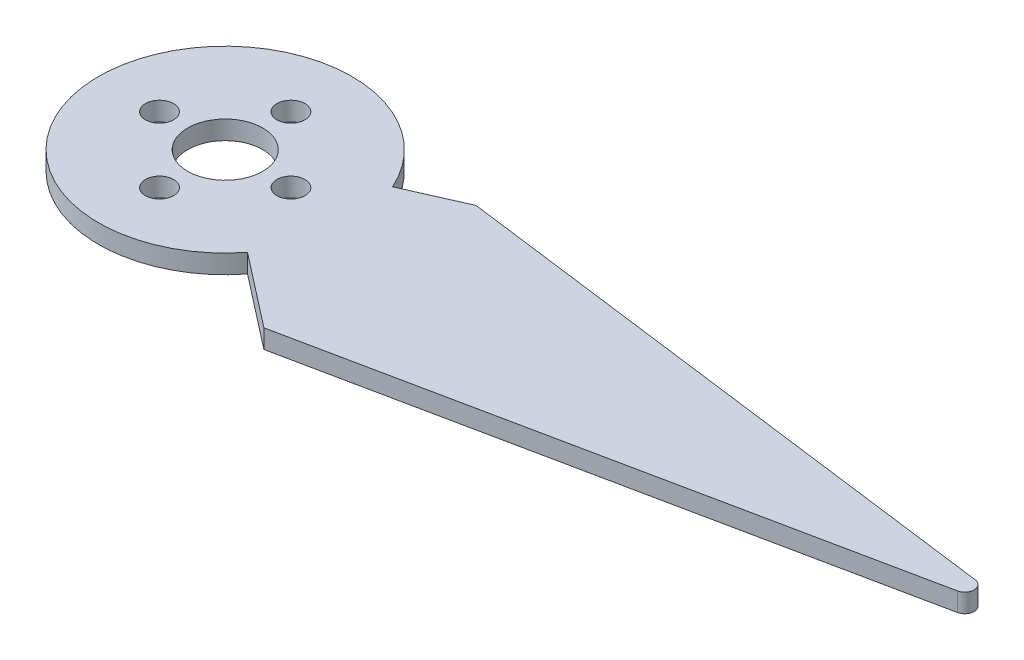
ISO-10303-21;
HEADER;
FILE_DESCRIPTION(('STEP AP214'),'2;1');
FILE_NAME('part.step','',(''),(''),'','','');
FILE_SCHEMA(('AUTOMOTIVE_DESIGN { 1 0 10303 214 1 1 1 1 }'));
ENDSEC;
DATA;
#1=APPLICATION_CONTEXT('core data for automotive mechanical design processes');
#2=APPLICATION_PROTOCOL_DEFINITION('international standard','automotive_design',2000,#1);
#3=PRODUCT_CONTEXT('',#1,'mechanical');
#4=PRODUCT('Part','Part','',(#3));
#5=PRODUCT_RELATED_PRODUCT_CATEGORY('part','',(#4));
#6=PRODUCT_DEFINITION_FORMATION('','',#4);
#7=PRODUCT_DEFINITION_CONTEXT('part definition',#1,'design');
#8=PRODUCT_DEFINITION('design','',#6,#7);
#9=PRODUCT_DEFINITION_SHAPE('','',#8);
#10=(LENGTH_UNIT() NAMED_UNIT(*) SI_UNIT(.MILLI.,.METRE.));
#11=(NAMED_UNIT(*) PLANE_ANGLE_UNIT() SI_UNIT($,.RADIAN.));
#12=(NAMED_UNIT(*) SI_UNIT($,.STERADIAN.) SOLID_ANGLE_UNIT());
#13=UNCERTAINTY_MEASURE_WITH_UNIT(LENGTH_MEASURE(1.E-05),#10,'distance_accuracy_value','');
#14=(GEOMETRIC_REPRESENTATION_CONTEXT(3) GLOBAL_UNCERTAINTY_ASSIGNED_CONTEXT((#13)) GLOBAL_UNIT_ASSIGNED_CONTEXT((#10,
#11,#12)) REPRESENTATION_CONTEXT('',''));
#15=CARTESIAN_POINT('',(0.,0.,0.));
#16=DIRECTION('',(0.,0.,1.));
#17=DIRECTION('',(1.,0.,0.));
#18=AXIS2_PLACEMENT_3D('',#15,#16,#17);
#19=CARTESIAN_POINT('',(0.,-2.,0.));
#20=DIRECTION('',(0.,1.,0.));
#21=DIRECTION('',(0.,0.,1.));
#22=AXIS2_PLACEMENT_3D('',#19,#20,#21);
#23=CYLINDRICAL_SURFACE('',#22,13.5002487061836);
#24=CARTESIAN_POINT('',(0.,0.,0.));
#25=DIRECTION('',(0.,1.,0.));
#26=DIRECTION('',(0.,0.,-1.));
#27=AXIS2_PLACEMENT_3D('',#24,#25,#26);
#28=CIRCLE('',#27,13.5002487061836);
#29=CARTESIAN_POINT('',(12.3377163256135,0.,-5.48064512603233));
#30=VERTEX_POINT('',#29);
#31=CARTESIAN_POINT('',(10.6592491181285,0.,8.28475246259592));
#32=VERTEX_POINT('',#31);
#33=EDGE_CURVE('E119',#30,#32,#28,.T.);
#34=ORIENTED_EDGE('',*,*,#33,.F.);
#35=DIRECTION('',(0.,1.,0.));
#36=VECTOR('',#35,1.);
#37=CARTESIAN_POINT('',(12.3377163256135,-2.,-5.48064512603233));
#38=LINE('',#37,#36);
#39=CARTESIAN_POINT('',(12.3377163256135,-2.,-5.48064512603233));
#40=VERTEX_POINT('',#39);
#41=EDGE_CURVE('E11',#40,#30,#38,.T.);
#42=ORIENTED_EDGE('',*,*,#41,.F.);
#43=CARTESIAN_POINT('',(0.,-2.,0.));
#44=DIRECTION('',(0.,1.,0.));
#45=DIRECTION('',(0.,0.,-1.));
#46=AXIS2_PLACEMENT_3D('',#43,#44,#45);
#47=CIRCLE('',#46,13.5002487061836);
#48=CARTESIAN_POINT('',(10.6592491181285,-2.,8.28475246259592));
#49=VERTEX_POINT('',#48);
#50=EDGE_CURVE('E134',#40,#49,#47,.T.);
#51=ORIENTED_EDGE('',*,*,#50,.T.);
#52=DIRECTION('',(0.,1.,0.));
#53=VECTOR('',#52,1.);
#54=CARTESIAN_POINT('',(10.6592491181285,-2.,8.28475246259592));
#55=LINE('',#54,#53);
#56=EDGE_CURVE('E37',#49,#32,#55,.T.);
#57=ORIENTED_EDGE('',*,*,#56,.T.);
#58=EDGE_LOOP('',(#34,#42,#51,#57));
#59=FACE_BOUND('',#58,.T.);
#60=ADVANCED_FACE('F34',(#59),#23,.T.);
#61=CARTESIAN_POINT('',(18.5,-2.,-8.21572495840736));
#62=DIRECTION('',(-0.405678539472798,0.,-0.914015821860441));
#63=DIRECTION('',(-0.914015821860441,0.,0.405678539472798));
#64=AXIS2_PLACEMENT_3D('',#61,#62,#63);
#65=PLANE('',#64);
#66=DIRECTION('',(-0.914015821860441,0.,0.405678539472798));
#67=VECTOR('',#66,1.);
#68=CARTESIAN_POINT('',(18.5,0.,-8.21572495840736));
#69=LINE('',#68,#67);
#70=CARTESIAN_POINT('',(18.5,0.,-8.21572495840736));
#71=VERTEX_POINT('',#70);
#72=EDGE_CURVE('E132',#71,#30,#69,.T.);
#73=ORIENTED_EDGE('',*,*,#72,.F.);
#74=DIRECTION('',(0.,1.,0.));
#75=VECTOR('',#74,1.);
#76=CARTESIAN_POINT('',(18.5,-2.,-8.21572495840736));
#77=LINE('',#76,#75);
#78=CARTESIAN_POINT('',(18.5,-2.,-8.21572495840736));
#79=VERTEX_POINT('',#78);
#80=EDGE_CURVE('E43',#79,#71,#77,.T.);
#81=ORIENTED_EDGE('',*,*,#80,.F.);
#82=DIRECTION('',(-0.914015821860441,0.,0.405678539472798));
#83=VECTOR('',#82,1.);
#84=CARTESIAN_POINT('',(18.5,-2.,-8.21572495840736));
#85=LINE('',#84,#83);
#86=EDGE_CURVE('E109',#79,#40,#85,.T.);
#87=ORIENTED_EDGE('',*,*,#86,.T.);
#88=ORIENTED_EDGE('',*,*,#41,.T.);
#89=EDGE_LOOP('',(#73,#81,#87,#88));
#90=FACE_BOUND('',#89,.T.);
#91=ADVANCED_FACE('F142',(#90),#65,.T.);
#92=CARTESIAN_POINT('',(79.636333374832,-2.,-0.26615071702802));
#93=DIRECTION('',(0.128944753513618,0.,-0.991651778872661));
#94=DIRECTION('',(-0.991651778872661,0.,-0.128944753513618));
#95=AXIS2_PLACEMENT_3D('',#92,#93,#94);
#96=PLANE('',#95);
#97=DIRECTION('',(-0.991651778872661,0.,-0.128944753513618));
#98=VECTOR('',#97,1.);
#99=CARTESIAN_POINT('',(79.636333374832,0.,-0.26615071702802));
#100=LINE('',#99,#98);
#101=CARTESIAN_POINT('',(79.636333374832,0.,-0.26615071702802));
#102=VERTEX_POINT('',#101);
#103=EDGE_CURVE('E96',#102,#71,#100,.T.);
#104=ORIENTED_EDGE('',*,*,#103,.F.);
#105=DIRECTION('',(0.,1.,0.));
#106=VECTOR('',#105,1.);
#107=CARTESIAN_POINT('',(79.636333374832,-2.,-0.26615071702802));
#108=LINE('',#107,#106);
#109=CARTESIAN_POINT('',(79.636333374832,-2.,-0.26615071702802));
#110=VERTEX_POINT('',#109);
#111=EDGE_CURVE('E91',#110,#102,#108,.T.);
#112=ORIENTED_EDGE('',*,*,#111,.F.);
#113=DIRECTION('',(-0.991651778872661,0.,-0.128944753513618));
#114=VECTOR('',#113,1.);
#115=CARTESIAN_POINT('',(79.636333374832,-2.,-0.26615071702802));
#116=LINE('',#115,#114);
#117=EDGE_CURVE('E94',#110,#79,#116,.T.);
#118=ORIENTED_EDGE('',*,*,#117,.T.);
#119=ORIENTED_EDGE('',*,*,#80,.T.);
#120=EDGE_LOOP('',(#104,#112,#118,#119));
#121=FACE_BOUND('',#120,.T.);
#122=ADVANCED_FACE('F93',(#121),#96,.T.);
#123=CARTESIAN_POINT('',(79.5073886213185,-2.,0.725501061844657));
#124=DIRECTION('',(0.,1.,0.));
#125=DIRECTION('',(0.,0.,1.));
#126=AXIS2_PLACEMENT_3D('',#123,#124,#125);
#127=CYLINDRICAL_SURFACE('',#126,1.);
#128=CARTESIAN_POINT('',(79.5073886213185,0.,0.725501061844657));
#129=DIRECTION('',(0.,1.,0.));
#130=DIRECTION('',(0.,0.,1.));
#131=AXIS2_PLACEMENT_3D('',#128,#129,#130);
#132=CIRCLE('',#131,1.);
#133=CARTESIAN_POINT('',(79.7101471484345,0.,1.70472982964192));
#134=VERTEX_POINT('',#133);
#135=EDGE_CURVE('E129',#134,#102,#132,.T.);
#136=ORIENTED_EDGE('',*,*,#135,.F.);
#137=DIRECTION('',(0.,1.,0.));
#138=VECTOR('',#137,1.);
#139=CARTESIAN_POINT('',(79.7101471484345,-2.,1.70472982964192));
#140=LINE('',#139,#138);
#141=CARTESIAN_POINT('',(79.7101471484345,-2.,1.70472982964192));
#142=VERTEX_POINT('',#141);
#143=EDGE_CURVE('E101',#142,#134,#140,.T.);
#144=ORIENTED_EDGE('',*,*,#143,.F.);
#145=CARTESIAN_POINT('',(79.5073886213185,-2.,0.725501061844657));
#146=DIRECTION('',(0.,1.,0.));
#147=DIRECTION('',(0.,0.,1.));
#148=AXIS2_PLACEMENT_3D('',#145,#146,#147);
#149=CIRCLE('',#148,1.);
#150=EDGE_CURVE('E107',#142,#110,#149,.T.);
#151=ORIENTED_EDGE('',*,*,#150,.T.);
#152=ORIENTED_EDGE('',*,*,#111,.T.);
#153=EDGE_LOOP('',(#136,#144,#151,#152));
#154=FACE_BOUND('',#153,.T.);
#155=ADVANCED_FACE('F111',(#154),#127,.T.);
#156=CARTESIAN_POINT('',(18.5,-2.,14.3788665467399));
#157=DIRECTION('',(0.202758527116121,0.,0.97922876779724));
#158=DIRECTION('',(0.97922876779724,0.,-0.202758527116121));
#159=AXIS2_PLACEMENT_3D('',#156,#157,#158);
#160=PLANE('',#159);
#161=DIRECTION('',(0.97922876779724,0.,-0.202758527116121));
#162=VECTOR('',#161,1.);
#163=CARTESIAN_POINT('',(18.5,0.,14.3788665467399));
#164=LINE('',#163,#162);
#165=CARTESIAN_POINT('',(18.5,0.,14.3788665467399));
#166=VERTEX_POINT('',#165);
#167=EDGE_CURVE('E126',#166,#134,#164,.T.);
#168=ORIENTED_EDGE('',*,*,#167,.F.);
#169=DIRECTION('',(0.,1.,0.));
#170=VECTOR('',#169,1.);
#171=CARTESIAN_POINT('',(18.5,-2.,14.3788665467399));
#172=LINE('',#171,#170);
#173=CARTESIAN_POINT('',(18.5,-2.,14.3788665467399));
#174=VERTEX_POINT('',#173);
#175=EDGE_CURVE('E137',#174,#166,#172,.T.);
#176=ORIENTED_EDGE('',*,*,#175,.F.);
#177=DIRECTION('',(0.97922876779724,0.,-0.202758527116121));
#178=VECTOR('',#177,1.);
#179=CARTESIAN_POINT('',(18.5,-2.,14.3788665467399));
#180=LINE('',#179,#178);
#181=EDGE_CURVE('E112',#174,#142,#180,.T.);
#182=ORIENTED_EDGE('',*,*,#181,.T.);
#183=ORIENTED_EDGE('',*,*,#143,.T.);
#184=EDGE_LOOP('',(#168,#176,#182,#183));
#185=FACE_BOUND('',#184,.T.);
#186=ADVANCED_FACE('F155',(#185),#160,.T.);
#187=CARTESIAN_POINT('',(10.6592491181285,-2.,8.28475246259592));
#188=DIRECTION('',(-0.613674062078665,0.,0.78955946294872));
#189=DIRECTION('',(0.78955946294872,0.,0.613674062078665));
#190=AXIS2_PLACEMENT_3D('',#187,#188,#189);
#191=PLANE('',#190);
#192=DIRECTION('',(0.78955946294872,0.,0.613674062078664));
#193=VECTOR('',#192,1.);
#194=CARTESIAN_POINT('',(10.6592491181285,0.,8.28475246259592));
#195=LINE('',#194,#193);
#196=EDGE_CURVE('E122',#32,#166,#195,.T.);
#197=ORIENTED_EDGE('',*,*,#196,.F.);
#198=ORIENTED_EDGE('',*,*,#56,.F.);
#199=DIRECTION('',(0.78955946294872,0.,0.613674062078664));
#200=VECTOR('',#199,1.);
#201=CARTESIAN_POINT('',(10.6592491181285,-2.,8.28475246259592));
#202=LINE('',#201,#200);
#203=EDGE_CURVE('E114',#49,#174,#202,.T.);
#204=ORIENTED_EDGE('',*,*,#203,.T.);
#205=ORIENTED_EDGE('',*,*,#175,.T.);
#206=EDGE_LOOP('',(#197,#198,#204,#205));
#207=FACE_BOUND('',#206,.T.);
#208=ADVANCED_FACE('F139',(#207),#191,.T.);
#209=CARTESIAN_POINT('',(0.,-2.,0.));
#210=DIRECTION('',(0.,-1.,0.));
#211=DIRECTION('',(0.,0.,-1.));
#212=AXIS2_PLACEMENT_3D('',#209,#210,#211);
#213=PLANE('',#212);
#214=CARTESIAN_POINT('',(7.,-2.,0.));
#215=DIRECTION('',(0.,1.,0.));
#216=DIRECTION('',(-1.,0.,0.));
#217=AXIS2_PLACEMENT_3D('',#214,#215,#216);
#218=CIRCLE('',#217,1.5);
#219=CARTESIAN_POINT('',(5.5,-2.,0.));
#220=VERTEX_POINT('',#219);
#221=EDGE_CURVE('E193',#220,#220,#218,.T.);
#222=ORIENTED_EDGE('',*,*,#221,.T.);
#223=EDGE_LOOP('',(#222));
#224=FACE_BOUND('',#223,.T.);
#225=CARTESIAN_POINT('',(0.,-2.,7.));
#226=DIRECTION('',(0.,1.,0.));
#227=DIRECTION('',(0.,0.,-1.));
#228=AXIS2_PLACEMENT_3D('',#225,#226,#227);
#229=CIRCLE('',#228,1.5);
#230=CARTESIAN_POINT('',(0.,-2.,5.5));
#231=VERTEX_POINT('',#230);
#232=EDGE_CURVE('E201',#231,#231,#229,.T.);
#233=ORIENTED_EDGE('',*,*,#232,.T.);
#234=EDGE_LOOP('',(#233));
#235=FACE_BOUND('',#234,.T.);
#236=CARTESIAN_POINT('',(-7.,-2.,0.));
#237=DIRECTION('',(0.,1.,0.));
#238=DIRECTION('',(1.,0.,0.));
#239=AXIS2_PLACEMENT_3D('',#236,#237,#238);
#240=CIRCLE('',#239,1.5);
#241=CARTESIAN_POINT('',(-5.5,-2.,0.));
#242=VERTEX_POINT('',#241);
#243=EDGE_CURVE('E207',#242,#242,#240,.T.);
#244=ORIENTED_EDGE('',*,*,#243,.T.);
#245=EDGE_LOOP('',(#244));
#246=FACE_BOUND('',#245,.T.);
#247=CARTESIAN_POINT('',(0.,-2.,-7.));
#248=DIRECTION('',(0.,1.,0.));
#249=DIRECTION('',(0.,0.,1.));
#250=AXIS2_PLACEMENT_3D('',#247,#248,#249);
#251=CIRCLE('',#250,1.5);
#252=CARTESIAN_POINT('',(0.,-2.,-5.5));
#253=VERTEX_POINT('',#252);
#254=EDGE_CURVE('E213',#253,#253,#251,.T.);
#255=ORIENTED_EDGE('',*,*,#254,.T.);
#256=EDGE_LOOP('',(#255));
#257=FACE_BOUND('',#256,.T.);
#258=CARTESIAN_POINT('',(0.,-2.,0.));
#259=DIRECTION('',(0.,1.,0.));
#260=DIRECTION('',(0.,0.,1.));
#261=AXIS2_PLACEMENT_3D('',#258,#259,#260);
#262=CIRCLE('',#261,4.);
#263=CARTESIAN_POINT('',(0.,-2.,4.));
#264=VERTEX_POINT('',#263);
#265=EDGE_CURVE('E123',#264,#264,#262,.T.);
#266=ORIENTED_EDGE('',*,*,#265,.T.);
#267=EDGE_LOOP('',(#266));
#268=FACE_BOUND('',#267,.T.);
#269=ORIENTED_EDGE('',*,*,#50,.F.);
#270=ORIENTED_EDGE('',*,*,#86,.F.);
#271=ORIENTED_EDGE('',*,*,#117,.F.);
#272=ORIENTED_EDGE('',*,*,#150,.F.);
#273=ORIENTED_EDGE('',*,*,#181,.F.);
#274=ORIENTED_EDGE('',*,*,#203,.F.);
#275=EDGE_LOOP('',(#269,#270,#271,#272,#273,#274));
#276=FACE_BOUND('',#275,.T.);
#277=ADVANCED_FACE('F105',(#224,#235,#246,#257,#268,#276),#213,.T.);
#278=CARTESIAN_POINT('',(0.,0.,0.));
#279=DIRECTION('',(0.,-1.,0.));
#280=DIRECTION('',(0.,0.,-1.));
#281=AXIS2_PLACEMENT_3D('',#278,#279,#280);
#282=PLANE('',#281);
#283=CARTESIAN_POINT('',(7.,0.,0.));
#284=DIRECTION('',(0.,1.,0.));
#285=DIRECTION('',(-1.,0.,0.));
#286=AXIS2_PLACEMENT_3D('',#283,#284,#285);
#287=CIRCLE('',#286,1.5);
#288=CARTESIAN_POINT('',(5.5,0.,0.));
#289=VERTEX_POINT('',#288);
#290=EDGE_CURVE('E196',#289,#289,#287,.T.);
#291=ORIENTED_EDGE('',*,*,#290,.F.);
#292=EDGE_LOOP('',(#291));
#293=FACE_BOUND('',#292,.T.);
#294=CARTESIAN_POINT('',(0.,0.,7.));
#295=DIRECTION('',(0.,1.,0.));
#296=DIRECTION('',(0.,0.,-1.));
#297=AXIS2_PLACEMENT_3D('',#294,#295,#296);
#298=CIRCLE('',#297,1.5);
#299=CARTESIAN_POINT('',(0.,0.,5.5));
#300=VERTEX_POINT('',#299);
#301=EDGE_CURVE('E198',#300,#300,#298,.T.);
#302=ORIENTED_EDGE('',*,*,#301,.F.);
#303=EDGE_LOOP('',(#302));
#304=FACE_BOUND('',#303,.T.);
#305=CARTESIAN_POINT('',(-7.,0.,0.));
#306=DIRECTION('',(0.,1.,0.));
#307=DIRECTION('',(1.,0.,0.));
#308=AXIS2_PLACEMENT_3D('',#305,#306,#307);
#309=CIRCLE('',#308,1.5);
#310=CARTESIAN_POINT('',(-5.5,0.,0.));
#311=VERTEX_POINT('',#310);
#312=EDGE_CURVE('E204',#311,#311,#309,.T.);
#313=ORIENTED_EDGE('',*,*,#312,.F.);
#314=EDGE_LOOP('',(#313));
#315=FACE_BOUND('',#314,.T.);
#316=CARTESIAN_POINT('',(0.,0.,-7.));
#317=DIRECTION('',(0.,1.,0.));
#318=DIRECTION('',(0.,0.,1.));
#319=AXIS2_PLACEMENT_3D('',#316,#317,#318);
#320=CIRCLE('',#319,1.5);
#321=CARTESIAN_POINT('',(0.,0.,-5.5));
#322=VERTEX_POINT('',#321);
#323=EDGE_CURVE('E210',#322,#322,#320,.T.);
#324=ORIENTED_EDGE('',*,*,#323,.F.);
#325=EDGE_LOOP('',(#324));
#326=FACE_BOUND('',#325,.T.);
#327=CARTESIAN_POINT('',(0.,0.,0.));
#328=DIRECTION('',(0.,1.,0.));
#329=DIRECTION('',(0.,0.,1.));
#330=AXIS2_PLACEMENT_3D('',#327,#328,#329);
#331=CIRCLE('',#330,4.);
#332=CARTESIAN_POINT('',(0.,0.,4.));
#333=VERTEX_POINT('',#332);
#334=EDGE_CURVE('E216',#333,#333,#331,.T.);
#335=ORIENTED_EDGE('',*,*,#334,.F.);
#336=EDGE_LOOP('',(#335));
#337=FACE_BOUND('',#336,.T.);
#338=ORIENTED_EDGE('',*,*,#33,.T.);
#339=ORIENTED_EDGE('',*,*,#196,.T.);
#340=ORIENTED_EDGE('',*,*,#167,.T.);
#341=ORIENTED_EDGE('',*,*,#135,.T.);
#342=ORIENTED_EDGE('',*,*,#103,.T.);
#343=ORIENTED_EDGE('',*,*,#72,.T.);
#344=EDGE_LOOP('',(#338,#339,#340,#341,#342,#343));
#345=FACE_BOUND('',#344,.T.);
#346=ADVANCED_FACE('F141',(#293,#304,#315,#326,#337,#345),#282,.F.);
#347=CARTESIAN_POINT('',(0.,-2.,0.));
#348=DIRECTION('',(0.,1.,0.));
#349=DIRECTION('',(0.,0.,1.));
#350=AXIS2_PLACEMENT_3D('',#347,#348,#349);
#351=CYLINDRICAL_SURFACE('',#350,4.);
#352=ORIENTED_EDGE('',*,*,#265,.F.);
#353=EDGE_LOOP('',(#352));
#354=FACE_BOUND('',#353,.T.);
#355=ORIENTED_EDGE('',*,*,#334,.T.);
#356=EDGE_LOOP('',(#355));
#357=FACE_BOUND('',#356,.T.);
#358=ADVANCED_FACE('F166',(#354,#357),#351,.F.);
#359=CARTESIAN_POINT('',(0.,-2.,-7.));
#360=DIRECTION('',(0.,1.,0.));
#361=DIRECTION('',(0.,0.,1.));
#362=AXIS2_PLACEMENT_3D('',#359,#360,#361);
#363=CYLINDRICAL_SURFACE('',#362,1.5);
#364=ORIENTED_EDGE('',*,*,#254,.F.);
#365=EDGE_LOOP('',(#364));
#366=FACE_BOUND('',#365,.T.);
#367=ORIENTED_EDGE('',*,*,#323,.T.);
#368=EDGE_LOOP('',(#367));
#369=FACE_BOUND('',#368,.T.);
#370=ADVANCED_FACE('F173',(#366,#369),#363,.F.);
#371=CARTESIAN_POINT('',(-7.,-2.,0.));
#372=DIRECTION('',(0.,1.,0.));
#373=DIRECTION('',(0.,0.,1.));
#374=AXIS2_PLACEMENT_3D('',#371,#372,#373);
#375=CYLINDRICAL_SURFACE('',#374,1.5);
#376=ORIENTED_EDGE('',*,*,#243,.F.);
#377=EDGE_LOOP('',(#376));
#378=FACE_BOUND('',#377,.T.);
#379=ORIENTED_EDGE('',*,*,#312,.T.);
#380=EDGE_LOOP('',(#379));
#381=FACE_BOUND('',#380,.T.);
#382=ADVANCED_FACE('F177',(#378,#381),#375,.F.);
#383=CARTESIAN_POINT('',(0.,-2.,7.));
#384=DIRECTION('',(0.,1.,0.));
#385=DIRECTION('',(0.,0.,1.));
#386=AXIS2_PLACEMENT_3D('',#383,#384,#385);
#387=CYLINDRICAL_SURFACE('',#386,1.5);
#388=ORIENTED_EDGE('',*,*,#232,.F.);
#389=EDGE_LOOP('',(#388));
#390=FACE_BOUND('',#389,.T.);
#391=ORIENTED_EDGE('',*,*,#301,.T.);
#392=EDGE_LOOP('',(#391));
#393=FACE_BOUND('',#392,.T.);
#394=ADVANCED_FACE('F181',(#390,#393),#387,.F.);
#395=CARTESIAN_POINT('',(7.,-2.,0.));
#396=DIRECTION('',(0.,1.,0.));
#397=DIRECTION('',(0.,0.,1.));
#398=AXIS2_PLACEMENT_3D('',#395,#396,#397);
#399=CYLINDRICAL_SURFACE('',#398,1.5);
#400=ORIENTED_EDGE('',*,*,#221,.F.);
#401=EDGE_LOOP('',(#400));
#402=FACE_BOUND('',#401,.T.);
#403=ORIENTED_EDGE('',*,*,#290,.T.);
#404=EDGE_LOOP('',(#403));
#405=FACE_BOUND('',#404,.T.);
#406=ADVANCED_FACE('F185',(#402,#405),#399,.F.);
#407=CLOSED_SHELL('',(#60,#91,#122,#155,#186,#208,#277,#346,#358,#370,#382,#394,#406));
#408=MANIFOLD_SOLID_BREP('B2',#407);
#409=ADVANCED_BREP_SHAPE_REPRESENTATION('',(#18,#408),#14);
#410=SHAPE_DEFINITION_REPRESENTATION(#9,#409);
ENDSEC;
END-ISO-10303-21;
